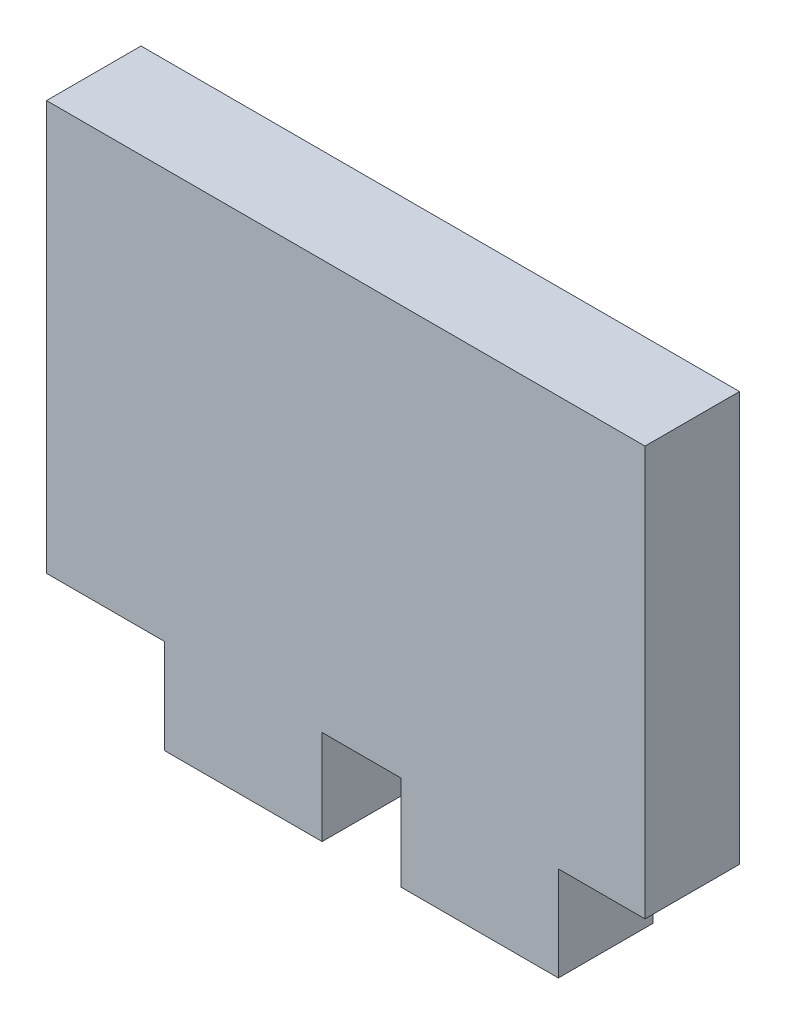
ISO-10303-21;
HEADER;
FILE_DESCRIPTION(('STEP AP214'),'2;1');
FILE_NAME('part.step','',(''),(''),'','','');
FILE_SCHEMA(('AUTOMOTIVE_DESIGN { 1 0 10303 214 1 1 1 1 }'));
ENDSEC;
DATA;
#1=APPLICATION_CONTEXT('core data for automotive mechanical design processes');
#2=APPLICATION_PROTOCOL_DEFINITION('international standard','automotive_design',2000,#1);
#3=PRODUCT_CONTEXT('',#1,'mechanical');
#4=PRODUCT('Part','Part','',(#3));
#5=PRODUCT_RELATED_PRODUCT_CATEGORY('part','',(#4));
#6=PRODUCT_DEFINITION_FORMATION('','',#4);
#7=PRODUCT_DEFINITION_CONTEXT('part definition',#1,'design');
#8=PRODUCT_DEFINITION('design','',#6,#7);
#9=PRODUCT_DEFINITION_SHAPE('','',#8);
#10=(LENGTH_UNIT() NAMED_UNIT(*) SI_UNIT(.MILLI.,.METRE.));
#11=(NAMED_UNIT(*) PLANE_ANGLE_UNIT() SI_UNIT($,.RADIAN.));
#12=(NAMED_UNIT(*) SI_UNIT($,.STERADIAN.) SOLID_ANGLE_UNIT());
#13=UNCERTAINTY_MEASURE_WITH_UNIT(LENGTH_MEASURE(1.E-05),#10,'distance_accuracy_value','');
#14=(GEOMETRIC_REPRESENTATION_CONTEXT(3) GLOBAL_UNCERTAINTY_ASSIGNED_CONTEXT((#13)) GLOBAL_UNIT_ASSIGNED_CONTEXT((#10,
#11,#12)) REPRESENTATION_CONTEXT('',''));
#15=CARTESIAN_POINT('',(0.,0.,0.));
#16=DIRECTION('',(0.,0.,1.));
#17=DIRECTION('',(1.,0.,0.));
#18=AXIS2_PLACEMENT_3D('',#15,#16,#17);
#19=CARTESIAN_POINT('',(0.,6.,6.));
#20=DIRECTION('',(1.,0.,0.));
#21=DIRECTION('',(0.,0.,-1.));
#22=AXIS2_PLACEMENT_3D('',#19,#20,#21);
#23=PLANE('',#22);
#24=DIRECTION('',(0.,-1.,0.));
#25=VECTOR('',#24,1.);
#26=CARTESIAN_POINT('',(0.,6.,0.));
#27=LINE('',#26,#25);
#28=CARTESIAN_POINT('',(0.,6.,0.));
#29=VERTEX_POINT('',#28);
#30=CARTESIAN_POINT('',(0.,0.,0.));
#31=VERTEX_POINT('',#30);
#32=EDGE_CURVE('E153',#29,#31,#27,.T.);
#33=ORIENTED_EDGE('',*,*,#32,.T.);
#34=DIRECTION('',(0.,0.,-1.));
#35=VECTOR('',#34,1.);
#36=CARTESIAN_POINT('',(0.,0.,6.));
#37=LINE('',#36,#35);
#38=CARTESIAN_POINT('',(0.,0.,6.));
#39=VERTEX_POINT('',#38);
#40=EDGE_CURVE('E11',#39,#31,#37,.T.);
#41=ORIENTED_EDGE('',*,*,#40,.F.);
#42=DIRECTION('',(0.,-1.,0.));
#43=VECTOR('',#42,1.);
#44=CARTESIAN_POINT('',(0.,6.,6.));
#45=LINE('',#44,#43);
#46=CARTESIAN_POINT('',(0.,6.,6.));
#47=VERTEX_POINT('',#46);
#48=EDGE_CURVE('E175',#47,#39,#45,.T.);
#49=ORIENTED_EDGE('',*,*,#48,.F.);
#50=DIRECTION('',(0.,0.,-1.));
#51=VECTOR('',#50,1.);
#52=CARTESIAN_POINT('',(0.,6.,6.));
#53=LINE('',#52,#51);
#54=EDGE_CURVE('E149',#47,#29,#53,.T.);
#55=ORIENTED_EDGE('',*,*,#54,.T.);
#56=EDGE_LOOP('',(#33,#41,#49,#55));
#57=FACE_BOUND('',#56,.T.);
#58=ADVANCED_FACE('F33',(#57),#23,.F.);
#59=CARTESIAN_POINT('',(0.,0.,6.));
#60=DIRECTION('',(0.,1.,0.));
#61=DIRECTION('',(0.,0.,1.));
#62=AXIS2_PLACEMENT_3D('',#59,#60,#61);
#63=PLANE('',#62);
#64=DIRECTION('',(1.,0.,0.));
#65=VECTOR('',#64,1.);
#66=CARTESIAN_POINT('',(0.,0.,0.));
#67=LINE('',#66,#65);
#68=CARTESIAN_POINT('',(10.,0.,0.));
#69=VERTEX_POINT('',#68);
#70=EDGE_CURVE('E156',#31,#69,#67,.T.);
#71=ORIENTED_EDGE('',*,*,#70,.T.);
#72=DIRECTION('',(0.,0.,-1.));
#73=VECTOR('',#72,1.);
#74=CARTESIAN_POINT('',(10.,0.,6.));
#75=LINE('',#74,#73);
#76=CARTESIAN_POINT('',(10.,0.,6.));
#77=VERTEX_POINT('',#76);
#78=EDGE_CURVE('E41',#77,#69,#75,.T.);
#79=ORIENTED_EDGE('',*,*,#78,.F.);
#80=DIRECTION('',(1.,0.,0.));
#81=VECTOR('',#80,1.);
#82=CARTESIAN_POINT('',(0.,0.,6.));
#83=LINE('',#82,#81);
#84=EDGE_CURVE('E104',#39,#77,#83,.T.);
#85=ORIENTED_EDGE('',*,*,#84,.F.);
#86=ORIENTED_EDGE('',*,*,#40,.T.);
#87=EDGE_LOOP('',(#71,#79,#85,#86));
#88=FACE_BOUND('',#87,.T.);
#89=ADVANCED_FACE('F253',(#88),#63,.F.);
#90=CARTESIAN_POINT('',(10.,0.,6.));
#91=DIRECTION('',(-1.,0.,0.));
#92=DIRECTION('',(0.,0.,1.));
#93=AXIS2_PLACEMENT_3D('',#90,#91,#92);
#94=PLANE('',#93);
#95=DIRECTION('',(0.,1.,0.));
#96=VECTOR('',#95,1.);
#97=CARTESIAN_POINT('',(10.,0.,0.));
#98=LINE('',#97,#96);
#99=CARTESIAN_POINT('',(10.,6.,0.));
#100=VERTEX_POINT('',#99);
#101=EDGE_CURVE('E158',#69,#100,#98,.T.);
#102=ORIENTED_EDGE('',*,*,#101,.T.);
#103=DIRECTION('',(0.,0.,-1.));
#104=VECTOR('',#103,1.);
#105=CARTESIAN_POINT('',(10.,6.,6.));
#106=LINE('',#105,#104);
#107=CARTESIAN_POINT('',(10.,6.,6.));
#108=VERTEX_POINT('',#107);
#109=EDGE_CURVE('E194',#108,#100,#106,.T.);
#110=ORIENTED_EDGE('',*,*,#109,.F.);
#111=DIRECTION('',(0.,1.,0.));
#112=VECTOR('',#111,1.);
#113=CARTESIAN_POINT('',(10.,0.,6.));
#114=LINE('',#113,#112);
#115=EDGE_CURVE('E202',#77,#108,#114,.T.);
#116=ORIENTED_EDGE('',*,*,#115,.F.);
#117=ORIENTED_EDGE('',*,*,#78,.T.);
#118=EDGE_LOOP('',(#102,#110,#116,#117));
#119=FACE_BOUND('',#118,.T.);
#120=ADVANCED_FACE('F200',(#119),#94,.F.);
#121=CARTESIAN_POINT('',(10.,6.,6.));
#122=DIRECTION('',(0.,1.,0.));
#123=DIRECTION('',(0.,0.,1.));
#124=AXIS2_PLACEMENT_3D('',#121,#122,#123);
#125=PLANE('',#124);
#126=DIRECTION('',(1.,0.,0.));
#127=VECTOR('',#126,1.);
#128=CARTESIAN_POINT('',(10.,6.,0.));
#129=LINE('',#128,#127);
#130=CARTESIAN_POINT('',(15.,6.,0.));
#131=VERTEX_POINT('',#130);
#132=EDGE_CURVE('E160',#100,#131,#129,.T.);
#133=ORIENTED_EDGE('',*,*,#132,.T.);
#134=DIRECTION('',(0.,0.,-1.));
#135=VECTOR('',#134,1.);
#136=CARTESIAN_POINT('',(15.,6.,6.));
#137=LINE('',#136,#135);
#138=CARTESIAN_POINT('',(15.,6.,6.));
#139=VERTEX_POINT('',#138);
#140=EDGE_CURVE('E191',#139,#131,#137,.T.);
#141=ORIENTED_EDGE('',*,*,#140,.F.);
#142=DIRECTION('',(1.,0.,0.));
#143=VECTOR('',#142,1.);
#144=CARTESIAN_POINT('',(10.,6.,6.));
#145=LINE('',#144,#143);
#146=EDGE_CURVE('E220',#108,#139,#145,.T.);
#147=ORIENTED_EDGE('',*,*,#146,.F.);
#148=ORIENTED_EDGE('',*,*,#109,.T.);
#149=EDGE_LOOP('',(#133,#141,#147,#148));
#150=FACE_BOUND('',#149,.T.);
#151=ADVANCED_FACE('F211',(#150),#125,.F.);
#152=CARTESIAN_POINT('',(15.,6.,6.));
#153=DIRECTION('',(1.,0.,0.));
#154=DIRECTION('',(0.,0.,-1.));
#155=AXIS2_PLACEMENT_3D('',#152,#153,#154);
#156=PLANE('',#155);
#157=DIRECTION('',(0.,-1.,0.));
#158=VECTOR('',#157,1.);
#159=CARTESIAN_POINT('',(15.,6.,0.));
#160=LINE('',#159,#158);
#161=CARTESIAN_POINT('',(15.,0.,0.));
#162=VERTEX_POINT('',#161);
#163=EDGE_CURVE('E162',#131,#162,#160,.T.);
#164=ORIENTED_EDGE('',*,*,#163,.T.);
#165=DIRECTION('',(0.,0.,-1.));
#166=VECTOR('',#165,1.);
#167=CARTESIAN_POINT('',(15.,0.,6.));
#168=LINE('',#167,#166);
#169=CARTESIAN_POINT('',(15.,0.,6.));
#170=VERTEX_POINT('',#169);
#171=EDGE_CURVE('E188',#170,#162,#168,.T.);
#172=ORIENTED_EDGE('',*,*,#171,.F.);
#173=DIRECTION('',(0.,-1.,0.));
#174=VECTOR('',#173,1.);
#175=CARTESIAN_POINT('',(15.,6.,6.));
#176=LINE('',#175,#174);
#177=EDGE_CURVE('E217',#139,#170,#176,.T.);
#178=ORIENTED_EDGE('',*,*,#177,.F.);
#179=ORIENTED_EDGE('',*,*,#140,.T.);
#180=EDGE_LOOP('',(#164,#172,#178,#179));
#181=FACE_BOUND('',#180,.T.);
#182=ADVANCED_FACE('F215',(#181),#156,.F.);
#183=CARTESIAN_POINT('',(15.,0.,6.));
#184=DIRECTION('',(0.,1.,0.));
#185=DIRECTION('',(0.,0.,1.));
#186=AXIS2_PLACEMENT_3D('',#183,#184,#185);
#187=PLANE('',#186);
#188=DIRECTION('',(1.,0.,0.));
#189=VECTOR('',#188,1.);
#190=CARTESIAN_POINT('',(15.,0.,0.));
#191=LINE('',#190,#189);
#192=CARTESIAN_POINT('',(25.,0.,0.));
#193=VERTEX_POINT('',#192);
#194=EDGE_CURVE('E164',#162,#193,#191,.T.);
#195=ORIENTED_EDGE('',*,*,#194,.T.);
#196=DIRECTION('',(0.,0.,-1.));
#197=VECTOR('',#196,1.);
#198=CARTESIAN_POINT('',(25.,0.,6.));
#199=LINE('',#198,#197);
#200=CARTESIAN_POINT('',(25.,0.,6.));
#201=VERTEX_POINT('',#200);
#202=EDGE_CURVE('E185',#201,#193,#199,.T.);
#203=ORIENTED_EDGE('',*,*,#202,.F.);
#204=DIRECTION('',(1.,0.,0.));
#205=VECTOR('',#204,1.);
#206=CARTESIAN_POINT('',(15.,0.,6.));
#207=LINE('',#206,#205);
#208=EDGE_CURVE('E219',#170,#201,#207,.T.);
#209=ORIENTED_EDGE('',*,*,#208,.F.);
#210=ORIENTED_EDGE('',*,*,#171,.T.);
#211=EDGE_LOOP('',(#195,#203,#209,#210));
#212=FACE_BOUND('',#211,.T.);
#213=ADVANCED_FACE('F266',(#212),#187,.F.);
#214=CARTESIAN_POINT('',(25.,0.,6.));
#215=DIRECTION('',(-1.,0.,0.));
#216=DIRECTION('',(0.,0.,1.));
#217=AXIS2_PLACEMENT_3D('',#214,#215,#216);
#218=PLANE('',#217);
#219=DIRECTION('',(0.,1.,0.));
#220=VECTOR('',#219,1.);
#221=CARTESIAN_POINT('',(25.,0.,0.));
#222=LINE('',#221,#220);
#223=CARTESIAN_POINT('',(25.,6.,0.));
#224=VERTEX_POINT('',#223);
#225=EDGE_CURVE('E166',#193,#224,#222,.T.);
#226=ORIENTED_EDGE('',*,*,#225,.T.);
#227=DIRECTION('',(0.,0.,-1.));
#228=VECTOR('',#227,1.);
#229=CARTESIAN_POINT('',(25.,6.,6.));
#230=LINE('',#229,#228);
#231=CARTESIAN_POINT('',(25.,6.,6.));
#232=VERTEX_POINT('',#231);
#233=EDGE_CURVE('E182',#232,#224,#230,.T.);
#234=ORIENTED_EDGE('',*,*,#233,.F.);
#235=DIRECTION('',(0.,1.,0.));
#236=VECTOR('',#235,1.);
#237=CARTESIAN_POINT('',(25.,0.,6.));
#238=LINE('',#237,#236);
#239=EDGE_CURVE('E222',#201,#232,#238,.T.);
#240=ORIENTED_EDGE('',*,*,#239,.F.);
#241=ORIENTED_EDGE('',*,*,#202,.T.);
#242=EDGE_LOOP('',(#226,#234,#240,#241));
#243=FACE_BOUND('',#242,.T.);
#244=ADVANCED_FACE('F269',(#243),#218,.F.);
#245=CARTESIAN_POINT('',(25.,6.,6.));
#246=DIRECTION('',(0.,1.,0.));
#247=DIRECTION('',(0.,0.,1.));
#248=AXIS2_PLACEMENT_3D('',#245,#246,#247);
#249=PLANE('',#248);
#250=DIRECTION('',(1.,0.,0.));
#251=VECTOR('',#250,1.);
#252=CARTESIAN_POINT('',(25.,6.,0.));
#253=LINE('',#252,#251);
#254=CARTESIAN_POINT('',(30.5,6.,0.));
#255=VERTEX_POINT('',#254);
#256=EDGE_CURVE('E168',#224,#255,#253,.T.);
#257=ORIENTED_EDGE('',*,*,#256,.T.);
#258=DIRECTION('',(0.,0.,-1.));
#259=VECTOR('',#258,1.);
#260=CARTESIAN_POINT('',(30.5,6.,6.));
#261=LINE('',#260,#259);
#262=CARTESIAN_POINT('',(30.5,6.,6.));
#263=VERTEX_POINT('',#262);
#264=EDGE_CURVE('E179',#263,#255,#261,.T.);
#265=ORIENTED_EDGE('',*,*,#264,.F.);
#266=DIRECTION('',(1.,0.,0.));
#267=VECTOR('',#266,1.);
#268=CARTESIAN_POINT('',(25.,6.,6.));
#269=LINE('',#268,#267);
#270=EDGE_CURVE('E228',#232,#263,#269,.T.);
#271=ORIENTED_EDGE('',*,*,#270,.F.);
#272=ORIENTED_EDGE('',*,*,#233,.T.);
#273=EDGE_LOOP('',(#257,#265,#271,#272));
#274=FACE_BOUND('',#273,.T.);
#275=ADVANCED_FACE('F234',(#274),#249,.F.);
#276=CARTESIAN_POINT('',(30.5,6.,6.));
#277=DIRECTION('',(-1.,0.,0.));
#278=DIRECTION('',(0.,-1.,0.));
#279=AXIS2_PLACEMENT_3D('',#276,#277,#278);
#280=PLANE('',#279);
#281=DIRECTION('',(0.,1.,0.));
#282=VECTOR('',#281,1.);
#283=CARTESIAN_POINT('',(30.5,6.,0.));
#284=LINE('',#283,#282);
#285=CARTESIAN_POINT('',(30.5,32.,0.));
#286=VERTEX_POINT('',#285);
#287=EDGE_CURVE('E170',#255,#286,#284,.T.);
#288=ORIENTED_EDGE('',*,*,#287,.T.);
#289=DIRECTION('',(0.,0.,-1.));
#290=VECTOR('',#289,1.);
#291=CARTESIAN_POINT('',(30.5,32.,6.));
#292=LINE('',#291,#290);
#293=CARTESIAN_POINT('',(30.5,32.,6.));
#294=VERTEX_POINT('',#293);
#295=EDGE_CURVE('E144',#294,#286,#292,.T.);
#296=ORIENTED_EDGE('',*,*,#295,.F.);
#297=DIRECTION('',(0.,1.,0.));
#298=VECTOR('',#297,1.);
#299=CARTESIAN_POINT('',(30.5,6.,6.));
#300=LINE('',#299,#298);
#301=EDGE_CURVE('E135',#263,#294,#300,.T.);
#302=ORIENTED_EDGE('',*,*,#301,.F.);
#303=ORIENTED_EDGE('',*,*,#264,.T.);
#304=EDGE_LOOP('',(#288,#296,#302,#303));
#305=FACE_BOUND('',#304,.T.);
#306=ADVANCED_FACE('F238',(#305),#280,.F.);
#307=CARTESIAN_POINT('',(30.5,32.,6.));
#308=DIRECTION('',(0.,-1.,0.));
#309=DIRECTION('',(1.,0.,0.));
#310=AXIS2_PLACEMENT_3D('',#307,#308,#309);
#311=PLANE('',#310);
#312=DIRECTION('',(-1.,0.,0.));
#313=VECTOR('',#312,1.);
#314=CARTESIAN_POINT('',(30.5,32.,0.));
#315=LINE('',#314,#313);
#316=CARTESIAN_POINT('',(-7.5,32.,0.));
#317=VERTEX_POINT('',#316);
#318=EDGE_CURVE('E143',#286,#317,#315,.T.);
#319=ORIENTED_EDGE('',*,*,#318,.T.);
#320=DIRECTION('',(0.,0.,-1.));
#321=VECTOR('',#320,1.);
#322=CARTESIAN_POINT('',(-7.5,32.,6.));
#323=LINE('',#322,#321);
#324=CARTESIAN_POINT('',(-7.5,32.,6.));
#325=VERTEX_POINT('',#324);
#326=EDGE_CURVE('E140',#325,#317,#323,.T.);
#327=ORIENTED_EDGE('',*,*,#326,.F.);
#328=DIRECTION('',(-1.,0.,0.));
#329=VECTOR('',#328,1.);
#330=CARTESIAN_POINT('',(30.5,32.,6.));
#331=LINE('',#330,#329);
#332=EDGE_CURVE('E129',#294,#325,#331,.T.);
#333=ORIENTED_EDGE('',*,*,#332,.F.);
#334=ORIENTED_EDGE('',*,*,#295,.T.);
#335=EDGE_LOOP('',(#319,#327,#333,#334));
#336=FACE_BOUND('',#335,.T.);
#337=ADVANCED_FACE('F141',(#336),#311,.F.);
#338=CARTESIAN_POINT('',(-7.5,32.,6.));
#339=DIRECTION('',(1.,0.,0.));
#340=DIRECTION('',(0.,1.,0.));
#341=AXIS2_PLACEMENT_3D('',#338,#339,#340);
#342=PLANE('',#341);
#343=DIRECTION('',(0.,-1.,0.));
#344=VECTOR('',#343,1.);
#345=CARTESIAN_POINT('',(-7.5,32.,0.));
#346=LINE('',#345,#344);
#347=CARTESIAN_POINT('',(-7.5,6.,0.));
#348=VERTEX_POINT('',#347);
#349=EDGE_CURVE('E90',#317,#348,#346,.T.);
#350=ORIENTED_EDGE('',*,*,#349,.T.);
#351=DIRECTION('',(0.,0.,-1.));
#352=VECTOR('',#351,1.);
#353=CARTESIAN_POINT('',(-7.5,6.,6.));
#354=LINE('',#353,#352);
#355=CARTESIAN_POINT('',(-7.5,6.,6.));
#356=VERTEX_POINT('',#355);
#357=EDGE_CURVE('E145',#356,#348,#354,.T.);
#358=ORIENTED_EDGE('',*,*,#357,.F.);
#359=DIRECTION('',(0.,-1.,0.));
#360=VECTOR('',#359,1.);
#361=CARTESIAN_POINT('',(-7.5,32.,6.));
#362=LINE('',#361,#360);
#363=EDGE_CURVE('E133',#325,#356,#362,.T.);
#364=ORIENTED_EDGE('',*,*,#363,.F.);
#365=ORIENTED_EDGE('',*,*,#326,.T.);
#366=EDGE_LOOP('',(#350,#358,#364,#365));
#367=FACE_BOUND('',#366,.T.);
#368=ADVANCED_FACE('F147',(#367),#342,.F.);
#369=CARTESIAN_POINT('',(-7.5,6.,6.));
#370=DIRECTION('',(0.,1.,0.));
#371=DIRECTION('',(0.,0.,1.));
#372=AXIS2_PLACEMENT_3D('',#369,#370,#371);
#373=PLANE('',#372);
#374=DIRECTION('',(1.,0.,0.));
#375=VECTOR('',#374,1.);
#376=CARTESIAN_POINT('',(-7.5,6.,0.));
#377=LINE('',#376,#375);
#378=EDGE_CURVE('E96',#348,#29,#377,.T.);
#379=ORIENTED_EDGE('',*,*,#378,.T.);
#380=ORIENTED_EDGE('',*,*,#54,.F.);
#381=DIRECTION('',(1.,0.,0.));
#382=VECTOR('',#381,1.);
#383=CARTESIAN_POINT('',(-7.5,6.,6.));
#384=LINE('',#383,#382);
#385=EDGE_CURVE('E49',#356,#47,#384,.T.);
#386=ORIENTED_EDGE('',*,*,#385,.F.);
#387=ORIENTED_EDGE('',*,*,#357,.T.);
#388=EDGE_LOOP('',(#379,#380,#386,#387));
#389=FACE_BOUND('',#388,.T.);
#390=ADVANCED_FACE('F242',(#389),#373,.F.);
#391=CARTESIAN_POINT('',(0.,0.,6.));
#392=DIRECTION('',(0.,0.,1.));
#393=DIRECTION('',(1.,0.,0.));
#394=AXIS2_PLACEMENT_3D('',#391,#392,#393);
#395=PLANE('',#394);
#396=ORIENTED_EDGE('',*,*,#48,.T.);
#397=ORIENTED_EDGE('',*,*,#84,.T.);
#398=ORIENTED_EDGE('',*,*,#115,.T.);
#399=ORIENTED_EDGE('',*,*,#146,.T.);
#400=ORIENTED_EDGE('',*,*,#177,.T.);
#401=ORIENTED_EDGE('',*,*,#208,.T.);
#402=ORIENTED_EDGE('',*,*,#239,.T.);
#403=ORIENTED_EDGE('',*,*,#270,.T.);
#404=ORIENTED_EDGE('',*,*,#301,.T.);
#405=ORIENTED_EDGE('',*,*,#332,.T.);
#406=ORIENTED_EDGE('',*,*,#363,.T.);
#407=ORIENTED_EDGE('',*,*,#385,.T.);
#408=EDGE_LOOP('',(#396,#397,#398,#399,#400,#401,#402,#403,#404,#405,#406,#407));
#409=FACE_BOUND('',#408,.T.);
#410=ADVANCED_FACE('F131',(#409),#395,.T.);
#411=CARTESIAN_POINT('',(0.,0.,0.));
#412=DIRECTION('',(0.,0.,1.));
#413=DIRECTION('',(1.,0.,0.));
#414=AXIS2_PLACEMENT_3D('',#411,#412,#413);
#415=PLANE('',#414);
#416=ORIENTED_EDGE('',*,*,#32,.F.);
#417=ORIENTED_EDGE('',*,*,#378,.F.);
#418=ORIENTED_EDGE('',*,*,#349,.F.);
#419=ORIENTED_EDGE('',*,*,#318,.F.);
#420=ORIENTED_EDGE('',*,*,#287,.F.);
#421=ORIENTED_EDGE('',*,*,#256,.F.);
#422=ORIENTED_EDGE('',*,*,#225,.F.);
#423=ORIENTED_EDGE('',*,*,#194,.F.);
#424=ORIENTED_EDGE('',*,*,#163,.F.);
#425=ORIENTED_EDGE('',*,*,#132,.F.);
#426=ORIENTED_EDGE('',*,*,#101,.F.);
#427=ORIENTED_EDGE('',*,*,#70,.F.);
#428=EDGE_LOOP('',(#416,#417,#418,#419,#420,#421,#422,#423,#424,#425,#426,#427));
#429=FACE_BOUND('',#428,.T.);
#430=ADVANCED_FACE('F206',(#429),#415,.F.);
#431=CLOSED_SHELL('',(#58,#89,#120,#151,#182,#213,#244,#275,#306,#337,#368,#390,#410,#430));
#432=MANIFOLD_SOLID_BREP('B2',#431);
#433=ADVANCED_BREP_SHAPE_REPRESENTATION('',(#18,#432),#14);
#434=SHAPE_DEFINITION_REPRESENTATION(#9,#433);
ENDSEC;
END-ISO-10303-21;
